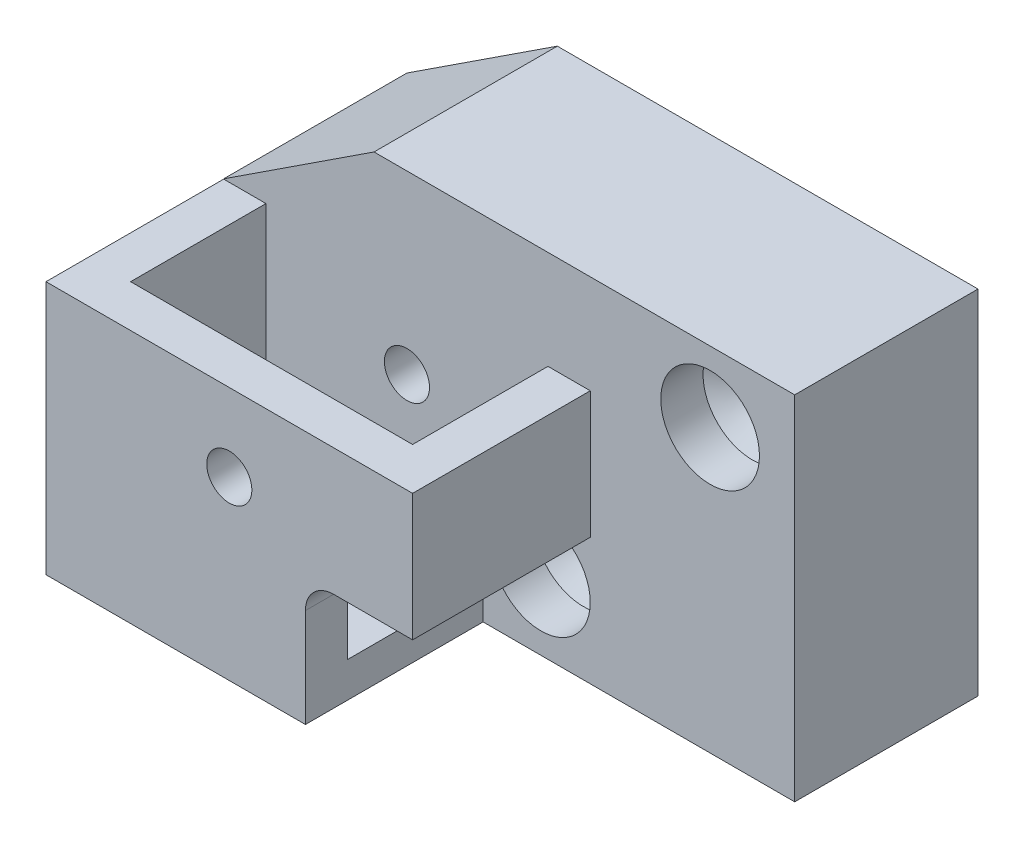
ISO-10303-21;
HEADER;
FILE_DESCRIPTION(('STEP AP214'),'2;1');
FILE_NAME('part.step','',(''),(''),'','','');
FILE_SCHEMA(('AUTOMOTIVE_DESIGN { 1 0 10303 214 1 1 1 1 }'));
ENDSEC;
DATA;
#1=APPLICATION_CONTEXT('core data for automotive mechanical design processes');
#2=APPLICATION_PROTOCOL_DEFINITION('international standard','automotive_design',2000,#1);
#3=PRODUCT_CONTEXT('',#1,'mechanical');
#4=PRODUCT('Part','Part','',(#3));
#5=PRODUCT_RELATED_PRODUCT_CATEGORY('part','',(#4));
#6=PRODUCT_DEFINITION_FORMATION('','',#4);
#7=PRODUCT_DEFINITION_CONTEXT('part definition',#1,'design');
#8=PRODUCT_DEFINITION('design','',#6,#7);
#9=PRODUCT_DEFINITION_SHAPE('','',#8);
#10=(LENGTH_UNIT() NAMED_UNIT(*) SI_UNIT(.MILLI.,.METRE.));
#11=(NAMED_UNIT(*) PLANE_ANGLE_UNIT() SI_UNIT($,.RADIAN.));
#12=(NAMED_UNIT(*) SI_UNIT($,.STERADIAN.) SOLID_ANGLE_UNIT());
#13=UNCERTAINTY_MEASURE_WITH_UNIT(LENGTH_MEASURE(1.E-05),#10,'distance_accuracy_value','');
#14=(GEOMETRIC_REPRESENTATION_CONTEXT(3) GLOBAL_UNCERTAINTY_ASSIGNED_CONTEXT((#13)) GLOBAL_UNIT_ASSIGNED_CONTEXT((#10,
#11,#12)) REPRESENTATION_CONTEXT('',''));
#15=CARTESIAN_POINT('',(0.,0.,0.));
#16=DIRECTION('',(0.,0.,1.));
#17=DIRECTION('',(1.,0.,0.));
#18=AXIS2_PLACEMENT_3D('',#15,#16,#17);
#19=CARTESIAN_POINT('',(269.1,0.,0.));
#20=DIRECTION('',(1.,0.,0.));
#21=DIRECTION('',(0.,0.,-1.));
#22=AXIS2_PLACEMENT_3D('',#19,#20,#21);
#23=PLANE('',#22);
#24=DIRECTION('',(0.,-1.,0.));
#25=VECTOR('',#24,1.);
#26=CARTESIAN_POINT('',(269.1,15.,20.1));
#27=LINE('',#26,#25);
#28=CARTESIAN_POINT('',(269.1,24.,20.1));
#29=VERTEX_POINT('',#28);
#30=CARTESIAN_POINT('',(269.1,15.,20.1));
#31=VERTEX_POINT('',#30);
#32=EDGE_CURVE('E309',#29,#31,#27,.T.);
#33=ORIENTED_EDGE('',*,*,#32,.F.);
#34=DIRECTION('',(0.,0.,1.));
#35=VECTOR('',#34,1.);
#36=CARTESIAN_POINT('',(269.1,24.,10.5));
#37=LINE('',#36,#35);
#38=CARTESIAN_POINT('',(269.1,24.,10.5));
#39=VERTEX_POINT('',#38);
#40=EDGE_CURVE('E321',#39,#29,#37,.T.);
#41=ORIENTED_EDGE('',*,*,#40,.F.);
#42=DIRECTION('',(0.,1.,0.));
#43=VECTOR('',#42,1.);
#44=CARTESIAN_POINT('',(269.1,15.,10.5));
#45=LINE('',#44,#43);
#46=CARTESIAN_POINT('',(269.1,15.,10.5));
#47=VERTEX_POINT('',#46);
#48=EDGE_CURVE('E328',#47,#39,#45,.T.);
#49=ORIENTED_EDGE('',*,*,#48,.F.);
#50=DIRECTION('',(0.,0.,-1.));
#51=VECTOR('',#50,1.);
#52=CARTESIAN_POINT('',(269.1,15.,23.1));
#53=LINE('',#52,#51);
#54=EDGE_CURVE('E324',#31,#47,#53,.T.);
#55=ORIENTED_EDGE('',*,*,#54,.F.);
#56=EDGE_LOOP('',(#33,#41,#49,#55));
#57=FACE_BOUND('',#56,.T.);
#58=ADVANCED_FACE('F33',(#57),#23,.F.);
#59=CARTESIAN_POINT('',(269.1,24.,10.5));
#60=DIRECTION('',(0.,1.,0.));
#61=DIRECTION('',(0.,0.,1.));
#62=AXIS2_PLACEMENT_3D('',#59,#60,#61);
#63=PLANE('',#62);
#64=DIRECTION('',(0.,0.,1.));
#65=VECTOR('',#64,1.);
#66=CARTESIAN_POINT('',(272.1,24.,10.5));
#67=LINE('',#66,#65);
#68=CARTESIAN_POINT('',(272.1,24.,10.5));
#69=VERTEX_POINT('',#68);
#70=CARTESIAN_POINT('',(272.1,24.,23.1));
#71=VERTEX_POINT('',#70);
#72=EDGE_CURVE('E320',#69,#71,#67,.T.);
#73=ORIENTED_EDGE('',*,*,#72,.F.);
#74=DIRECTION('',(1.,0.,0.));
#75=VECTOR('',#74,1.);
#76=CARTESIAN_POINT('',(269.1,24.,10.5));
#77=LINE('',#76,#75);
#78=EDGE_CURVE('E341',#39,#69,#77,.T.);
#79=ORIENTED_EDGE('',*,*,#78,.F.);
#80=ORIENTED_EDGE('',*,*,#40,.T.);
#81=DIRECTION('',(1.,0.,0.));
#82=VECTOR('',#81,1.);
#83=CARTESIAN_POINT('',(249.1,24.,20.1));
#84=LINE('',#83,#82);
#85=CARTESIAN_POINT('',(249.1,24.,20.1));
#86=VERTEX_POINT('',#85);
#87=EDGE_CURVE('E317',#86,#29,#84,.T.);
#88=ORIENTED_EDGE('',*,*,#87,.F.);
#89=DIRECTION('',(0.,0.,-1.));
#90=VECTOR('',#89,1.);
#91=CARTESIAN_POINT('',(249.1,24.,10.5));
#92=LINE('',#91,#90);
#93=CARTESIAN_POINT('',(249.1,24.,10.5));
#94=VERTEX_POINT('',#93);
#95=EDGE_CURVE('E296',#86,#94,#92,.T.);
#96=ORIENTED_EDGE('',*,*,#95,.T.);
#97=DIRECTION('',(1.,0.,0.));
#98=VECTOR('',#97,1.);
#99=CARTESIAN_POINT('',(246.1,24.,10.5));
#100=LINE('',#99,#98);
#101=CARTESIAN_POINT('',(246.1,24.,10.5));
#102=VERTEX_POINT('',#101);
#103=EDGE_CURVE('E303',#102,#94,#100,.T.);
#104=ORIENTED_EDGE('',*,*,#103,.F.);
#105=DIRECTION('',(0.,0.,-1.));
#106=VECTOR('',#105,1.);
#107=CARTESIAN_POINT('',(246.1,24.,10.5));
#108=LINE('',#107,#106);
#109=CARTESIAN_POINT('',(246.1,24.,23.1));
#110=VERTEX_POINT('',#109);
#111=EDGE_CURVE('E300',#110,#102,#108,.T.);
#112=ORIENTED_EDGE('',*,*,#111,.F.);
#113=DIRECTION('',(1.,0.,0.));
#114=VECTOR('',#113,1.);
#115=CARTESIAN_POINT('',(269.1,24.,23.1));
#116=LINE('',#115,#114);
#117=EDGE_CURVE('E330',#110,#71,#116,.T.);
#118=ORIENTED_EDGE('',*,*,#117,.T.);
#119=EDGE_LOOP('',(#73,#79,#80,#88,#96,#104,#112,#118));
#120=FACE_BOUND('',#119,.T.);
#121=ADVANCED_FACE('F431',(#120),#63,.T.);
#122=CARTESIAN_POINT('',(269.1,15.,23.1));
#123=DIRECTION('',(0.,-1.,0.));
#124=DIRECTION('',(0.,0.,-1.));
#125=AXIS2_PLACEMENT_3D('',#122,#123,#124);
#126=PLANE('',#125);
#127=DIRECTION('',(1.,0.,0.));
#128=VECTOR('',#127,1.);
#129=CARTESIAN_POINT('',(269.1,15.,23.1));
#130=LINE('',#129,#128);
#131=CARTESIAN_POINT('',(266.5,15.,23.1));
#132=VERTEX_POINT('',#131);
#133=CARTESIAN_POINT('',(272.1,15.,23.1));
#134=VERTEX_POINT('',#133);
#135=EDGE_CURVE('E347',#132,#134,#130,.T.);
#136=ORIENTED_EDGE('',*,*,#135,.F.);
#137=DIRECTION('',(0.,0.,1.));
#138=VECTOR('',#137,1.);
#139=CARTESIAN_POINT('',(266.5,15.,23.1));
#140=LINE('',#139,#138);
#141=CARTESIAN_POINT('',(266.5,15.,20.1));
#142=VERTEX_POINT('',#141);
#143=EDGE_CURVE('E374',#132,#142,#140,.F.);
#144=ORIENTED_EDGE('',*,*,#143,.T.);
#145=DIRECTION('',(1.,0.,0.));
#146=VECTOR('',#145,1.);
#147=CARTESIAN_POINT('',(249.1,15.,20.1));
#148=LINE('',#147,#146);
#149=EDGE_CURVE('E313',#142,#31,#148,.T.);
#150=ORIENTED_EDGE('',*,*,#149,.T.);
#151=ORIENTED_EDGE('',*,*,#54,.T.);
#152=DIRECTION('',(1.,0.,0.));
#153=VECTOR('',#152,1.);
#154=CARTESIAN_POINT('',(269.1,15.,10.5));
#155=LINE('',#154,#153);
#156=CARTESIAN_POINT('',(272.1,15.,10.5));
#157=VERTEX_POINT('',#156);
#158=EDGE_CURVE('E344',#47,#157,#155,.T.);
#159=ORIENTED_EDGE('',*,*,#158,.T.);
#160=DIRECTION('',(0.,0.,-1.));
#161=VECTOR('',#160,1.);
#162=CARTESIAN_POINT('',(272.1,15.,23.1));
#163=LINE('',#162,#161);
#164=EDGE_CURVE('E336',#134,#157,#163,.T.);
#165=ORIENTED_EDGE('',*,*,#164,.F.);
#166=EDGE_LOOP('',(#136,#144,#150,#151,#159,#165));
#167=FACE_BOUND('',#166,.T.);
#168=ADVANCED_FACE('F377',(#167),#126,.T.);
#169=CARTESIAN_POINT('',(269.1,24.,23.1));
#170=DIRECTION('',(0.,0.,1.));
#171=DIRECTION('',(1.,0.,0.));
#172=AXIS2_PLACEMENT_3D('',#169,#170,#171);
#173=PLANE('',#172);
#174=CARTESIAN_POINT('',(259.1,18.5,23.1));
#175=DIRECTION('',(0.,0.,1.));
#176=DIRECTION('',(1.,0.,0.));
#177=AXIS2_PLACEMENT_3D('',#174,#175,#176);
#178=CIRCLE('',#177,1.59999999999999);
#179=CARTESIAN_POINT('',(260.7,18.5,23.1));
#180=VERTEX_POINT('',#179);
#181=EDGE_CURVE('E544',#180,#180,#178,.T.);
#182=ORIENTED_EDGE('',*,*,#181,.F.);
#183=EDGE_LOOP('',(#182));
#184=FACE_BOUND('',#183,.T.);
#185=DIRECTION('',(0.,-1.,0.));
#186=VECTOR('',#185,1.);
#187=CARTESIAN_POINT('',(272.1,24.,23.1));
#188=LINE('',#187,#186);
#189=EDGE_CURVE('E333',#71,#134,#188,.T.);
#190=ORIENTED_EDGE('',*,*,#189,.F.);
#191=ORIENTED_EDGE('',*,*,#117,.F.);
#192=DIRECTION('',(0.,1.,0.));
#193=VECTOR('',#192,1.);
#194=CARTESIAN_POINT('',(246.1,24.,23.1));
#195=LINE('',#194,#193);
#196=CARTESIAN_POINT('',(246.1,5.99999999999983,23.1));
#197=VERTEX_POINT('',#196);
#198=EDGE_CURVE('E297',#197,#110,#195,.T.);
#199=ORIENTED_EDGE('',*,*,#198,.F.);
#200=DIRECTION('',(-1.,0.,0.));
#201=VECTOR('',#200,1.);
#202=CARTESIAN_POINT('',(246.1,5.99999999999983,23.1));
#203=LINE('',#202,#201);
#204=CARTESIAN_POINT('',(264.5,5.9999999999998,23.1));
#205=VERTEX_POINT('',#204);
#206=EDGE_CURVE('E277',#205,#197,#203,.T.);
#207=ORIENTED_EDGE('',*,*,#206,.F.);
#208=DIRECTION('',(0.,1.,0.));
#209=VECTOR('',#208,1.);
#210=CARTESIAN_POINT('',(264.5,8.49999999999996,23.1));
#211=LINE('',#210,#209);
#212=CARTESIAN_POINT('',(264.5,13.,23.1));
#213=VERTEX_POINT('',#212);
#214=EDGE_CURVE('E291',#205,#213,#211,.T.);
#215=ORIENTED_EDGE('',*,*,#214,.T.);
#216=CARTESIAN_POINT('',(266.5,13.,23.1));
#217=DIRECTION('',(0.,0.,1.));
#218=DIRECTION('',(1.,0.,0.));
#219=AXIS2_PLACEMENT_3D('',#216,#217,#218);
#220=CIRCLE('',#219,2.);
#221=EDGE_CURVE('E41',#213,#132,#220,.F.);
#222=ORIENTED_EDGE('',*,*,#221,.T.);
#223=ORIENTED_EDGE('',*,*,#135,.T.);
#224=EDGE_LOOP('',(#190,#191,#199,#207,#215,#222,#223));
#225=FACE_BOUND('',#224,.T.);
#226=ADVANCED_FACE('F389',(#184,#225),#173,.T.);
#227=CARTESIAN_POINT('',(272.1,0.,0.));
#228=DIRECTION('',(1.,0.,0.));
#229=DIRECTION('',(0.,0.,-1.));
#230=AXIS2_PLACEMENT_3D('',#227,#228,#229);
#231=PLANE('',#230);
#232=ORIENTED_EDGE('',*,*,#72,.T.);
#233=ORIENTED_EDGE('',*,*,#189,.T.);
#234=ORIENTED_EDGE('',*,*,#164,.T.);
#235=DIRECTION('',(0.,1.,0.));
#236=VECTOR('',#235,1.);
#237=CARTESIAN_POINT('',(272.1,15.,10.5));
#238=LINE('',#237,#236);
#239=EDGE_CURVE('E325',#157,#69,#238,.T.);
#240=ORIENTED_EDGE('',*,*,#239,.T.);
#241=EDGE_LOOP('',(#232,#233,#234,#240));
#242=FACE_BOUND('',#241,.T.);
#243=ADVANCED_FACE('F442',(#242),#231,.T.);
#244=CARTESIAN_POINT('',(249.1,15.,20.1));
#245=DIRECTION('',(0.,0.,1.));
#246=DIRECTION('',(1.,0.,0.));
#247=AXIS2_PLACEMENT_3D('',#244,#245,#246);
#248=PLANE('',#247);
#249=CARTESIAN_POINT('',(259.1,18.5,20.1));
#250=DIRECTION('',(0.,0.,1.));
#251=DIRECTION('',(1.,0.,0.));
#252=AXIS2_PLACEMENT_3D('',#249,#250,#251);
#253=CIRCLE('',#252,1.59999999999999);
#254=CARTESIAN_POINT('',(260.7,18.5,20.1));
#255=VERTEX_POINT('',#254);
#256=EDGE_CURVE('E547',#255,#255,#253,.T.);
#257=ORIENTED_EDGE('',*,*,#256,.T.);
#258=EDGE_LOOP('',(#257));
#259=FACE_BOUND('',#258,.T.);
#260=DIRECTION('',(1.,0.,0.));
#261=VECTOR('',#260,1.);
#262=CARTESIAN_POINT('',(264.5,8.49999999999996,20.1));
#263=LINE('',#262,#261);
#264=CARTESIAN_POINT('',(251.1,8.49999999999996,20.1));
#265=VERTEX_POINT('',#264);
#266=CARTESIAN_POINT('',(264.5,8.49999999999959,20.1));
#267=VERTEX_POINT('',#266);
#268=EDGE_CURVE('E289',#265,#267,#263,.T.);
#269=ORIENTED_EDGE('',*,*,#268,.F.);
#270=CARTESIAN_POINT('',(251.1,10.4999999999996,20.1));
#271=DIRECTION('',(0.,0.,1.));
#272=DIRECTION('',(1.,0.,0.));
#273=AXIS2_PLACEMENT_3D('',#270,#271,#272);
#274=CIRCLE('',#273,2.);
#275=CARTESIAN_POINT('',(249.1,10.4999999999996,20.1));
#276=VERTEX_POINT('',#275);
#277=EDGE_CURVE('E366',#265,#276,#274,.F.);
#278=ORIENTED_EDGE('',*,*,#277,.T.);
#279=DIRECTION('',(0.,-1.,0.));
#280=VECTOR('',#279,1.);
#281=CARTESIAN_POINT('',(249.1,15.,20.1));
#282=LINE('',#281,#280);
#283=EDGE_CURVE('E310',#86,#276,#282,.T.);
#284=ORIENTED_EDGE('',*,*,#283,.F.);
#285=ORIENTED_EDGE('',*,*,#87,.T.);
#286=ORIENTED_EDGE('',*,*,#32,.T.);
#287=ORIENTED_EDGE('',*,*,#149,.F.);
#288=CARTESIAN_POINT('',(266.5,13.,20.1));
#289=DIRECTION('',(0.,0.,1.));
#290=DIRECTION('',(1.,0.,0.));
#291=AXIS2_PLACEMENT_3D('',#288,#289,#290);
#292=CIRCLE('',#291,2.);
#293=CARTESIAN_POINT('',(264.5,13.,20.1));
#294=VERTEX_POINT('',#293);
#295=EDGE_CURVE('E11',#142,#294,#292,.T.);
#296=ORIENTED_EDGE('',*,*,#295,.T.);
#297=DIRECTION('',(0.,1.,0.));
#298=VECTOR('',#297,1.);
#299=CARTESIAN_POINT('',(264.5,8.49999999999996,20.1));
#300=LINE('',#299,#298);
#301=EDGE_CURVE('E293',#267,#294,#300,.T.);
#302=ORIENTED_EDGE('',*,*,#301,.F.);
#303=EDGE_LOOP('',(#269,#278,#284,#285,#286,#287,#296,#302));
#304=FACE_BOUND('',#303,.T.);
#305=ADVANCED_FACE('F383',(#259,#304),#248,.F.);
#306=CARTESIAN_POINT('',(246.1,0.,0.));
#307=DIRECTION('',(1.,0.,0.));
#308=DIRECTION('',(0.,0.,-1.));
#309=AXIS2_PLACEMENT_3D('',#306,#307,#308);
#310=PLANE('',#309);
#311=DIRECTION('',(0.,1.,0.));
#312=VECTOR('',#311,1.);
#313=CARTESIAN_POINT('',(246.1,31.0000000000001,10.5));
#314=LINE('',#313,#312);
#315=CARTESIAN_POINT('',(246.1,24.018019493939,10.5));
#316=VERTEX_POINT('',#315);
#317=EDGE_CURVE('E251',#102,#316,#314,.T.);
#318=ORIENTED_EDGE('',*,*,#317,.T.);
#319=DIRECTION('',(0.,0.,-1.));
#320=VECTOR('',#319,1.);
#321=CARTESIAN_POINT('',(246.1,24.018019493939,0.));
#322=LINE('',#321,#320);
#323=CARTESIAN_POINT('',(246.1,24.018019493939,-2.5));
#324=VERTEX_POINT('',#323);
#325=EDGE_CURVE('E359',#316,#324,#322,.T.);
#326=ORIENTED_EDGE('',*,*,#325,.T.);
#327=DIRECTION('',(0.,1.,0.));
#328=VECTOR('',#327,1.);
#329=CARTESIAN_POINT('',(246.1,31.0000000000001,-2.5));
#330=LINE('',#329,#328);
#331=CARTESIAN_POINT('',(246.1,6.00000000000023,-2.5));
#332=VERTEX_POINT('',#331);
#333=EDGE_CURVE('E256',#332,#324,#330,.T.);
#334=ORIENTED_EDGE('',*,*,#333,.F.);
#335=DIRECTION('',(0.,0.,-1.));
#336=VECTOR('',#335,1.);
#337=CARTESIAN_POINT('',(246.1,5.99999999999983,10.5));
#338=LINE('',#337,#336);
#339=EDGE_CURVE('E281',#197,#332,#338,.T.);
#340=ORIENTED_EDGE('',*,*,#339,.F.);
#341=ORIENTED_EDGE('',*,*,#198,.T.);
#342=ORIENTED_EDGE('',*,*,#111,.T.);
#343=EDGE_LOOP('',(#318,#326,#334,#340,#341,#342));
#344=FACE_BOUND('',#343,.T.);
#345=ADVANCED_FACE('F396',(#344),#310,.F.);
#346=CARTESIAN_POINT('',(249.1,0.,0.));
#347=DIRECTION('',(1.,0.,0.));
#348=DIRECTION('',(0.,0.,-1.));
#349=AXIS2_PLACEMENT_3D('',#346,#347,#348);
#350=PLANE('',#349);
#351=ORIENTED_EDGE('',*,*,#283,.T.);
#352=DIRECTION('',(0.,0.,1.));
#353=VECTOR('',#352,1.);
#354=CARTESIAN_POINT('',(249.1,10.4999999999996,10.5));
#355=LINE('',#354,#353);
#356=CARTESIAN_POINT('',(249.1,10.4999999999996,10.5));
#357=VERTEX_POINT('',#356);
#358=EDGE_CURVE('E368',#276,#357,#355,.F.);
#359=ORIENTED_EDGE('',*,*,#358,.T.);
#360=DIRECTION('',(0.,-1.,0.));
#361=VECTOR('',#360,1.);
#362=CARTESIAN_POINT('',(249.1,15.,10.5));
#363=LINE('',#362,#361);
#364=EDGE_CURVE('E301',#94,#357,#363,.T.);
#365=ORIENTED_EDGE('',*,*,#364,.F.);
#366=ORIENTED_EDGE('',*,*,#95,.F.);
#367=EDGE_LOOP('',(#351,#359,#365,#366));
#368=FACE_BOUND('',#367,.T.);
#369=ADVANCED_FACE('F470',(#368),#350,.T.);
#370=CARTESIAN_POINT('',(264.5,8.49999999999996,23.1));
#371=DIRECTION('',(-1.,0.,0.));
#372=DIRECTION('',(0.,0.,1.));
#373=AXIS2_PLACEMENT_3D('',#370,#371,#372);
#374=PLANE('',#373);
#375=ORIENTED_EDGE('',*,*,#301,.T.);
#376=DIRECTION('',(0.,0.,1.));
#377=VECTOR('',#376,1.);
#378=CARTESIAN_POINT('',(264.5,13.,23.1));
#379=LINE('',#378,#377);
#380=EDGE_CURVE('E372',#294,#213,#379,.T.);
#381=ORIENTED_EDGE('',*,*,#380,.T.);
#382=ORIENTED_EDGE('',*,*,#214,.F.);
#383=DIRECTION('',(0.,0.,1.));
#384=VECTOR('',#383,1.);
#385=CARTESIAN_POINT('',(264.5,5.9999999999998,23.1));
#386=LINE('',#385,#384);
#387=CARTESIAN_POINT('',(264.5,5.9999999999998,10.5));
#388=VERTEX_POINT('',#387);
#389=EDGE_CURVE('E274',#388,#205,#386,.T.);
#390=ORIENTED_EDGE('',*,*,#389,.F.);
#391=DIRECTION('',(0.,1.,0.));
#392=VECTOR('',#391,1.);
#393=CARTESIAN_POINT('',(264.5,5.9999999999998,10.5));
#394=LINE('',#393,#392);
#395=CARTESIAN_POINT('',(264.5,8.49999999999959,10.5));
#396=VERTEX_POINT('',#395);
#397=EDGE_CURVE('E283',#388,#396,#394,.T.);
#398=ORIENTED_EDGE('',*,*,#397,.T.);
#399=DIRECTION('',(0.,0.,1.));
#400=VECTOR('',#399,1.);
#401=CARTESIAN_POINT('',(264.5,8.49999999999959,23.1));
#402=LINE('',#401,#400);
#403=EDGE_CURVE('E278',#396,#267,#402,.T.);
#404=ORIENTED_EDGE('',*,*,#403,.T.);
#405=EDGE_LOOP('',(#375,#381,#382,#390,#398,#404));
#406=FACE_BOUND('',#405,.T.);
#407=ADVANCED_FACE('F386',(#406),#374,.F.);
#408=CARTESIAN_POINT('',(0.,6.00000000000017,0.));
#409=DIRECTION('',(0.,1.,0.));
#410=DIRECTION('',(-1.,0.,0.));
#411=AXIS2_PLACEMENT_3D('',#408,#409,#410);
#412=PLANE('',#411);
#413=ORIENTED_EDGE('',*,*,#339,.T.);
#414=DIRECTION('',(-1.,0.,0.));
#415=VECTOR('',#414,1.);
#416=CARTESIAN_POINT('',(246.1,6.00000000000023,-2.5));
#417=LINE('',#416,#415);
#418=CARTESIAN_POINT('',(286.599999999998,6.00000000000016,-2.5));
#419=VERTEX_POINT('',#418);
#420=EDGE_CURVE('E253',#419,#332,#417,.T.);
#421=ORIENTED_EDGE('',*,*,#420,.F.);
#422=DIRECTION('',(0.,0.,1.));
#423=VECTOR('',#422,1.);
#424=CARTESIAN_POINT('',(286.599999999998,6.00000000000016,-2.5));
#425=LINE('',#424,#423);
#426=CARTESIAN_POINT('',(286.599999999998,6.00000000000016,10.5));
#427=VERTEX_POINT('',#426);
#428=EDGE_CURVE('E259',#419,#427,#425,.T.);
#429=ORIENTED_EDGE('',*,*,#428,.T.);
#430=DIRECTION('',(-1.,0.,0.));
#431=VECTOR('',#430,1.);
#432=CARTESIAN_POINT('',(246.1,6.00000000000023,10.5));
#433=LINE('',#432,#431);
#434=EDGE_CURVE('E263',#427,#388,#433,.T.);
#435=ORIENTED_EDGE('',*,*,#434,.T.);
#436=ORIENTED_EDGE('',*,*,#389,.T.);
#437=ORIENTED_EDGE('',*,*,#206,.T.);
#438=EDGE_LOOP('',(#413,#421,#429,#435,#436,#437));
#439=FACE_BOUND('',#438,.T.);
#440=ADVANCED_FACE('F392',(#439),#412,.F.);
#441=CARTESIAN_POINT('',(0.,8.49999999999996,0.));
#442=DIRECTION('',(0.,1.,0.));
#443=DIRECTION('',(-1.,0.,0.));
#444=AXIS2_PLACEMENT_3D('',#441,#442,#443);
#445=PLANE('',#444);
#446=DIRECTION('',(1.,0.,0.));
#447=VECTOR('',#446,1.);
#448=CARTESIAN_POINT('',(264.5,8.49999999999959,10.5));
#449=LINE('',#448,#447);
#450=CARTESIAN_POINT('',(251.1,8.49999999999961,10.5));
#451=VERTEX_POINT('',#450);
#452=EDGE_CURVE('E273',#451,#396,#449,.T.);
#453=ORIENTED_EDGE('',*,*,#452,.F.);
#454=DIRECTION('',(0.,0.,1.));
#455=VECTOR('',#454,1.);
#456=CARTESIAN_POINT('',(251.1,8.49999999999961,20.1));
#457=LINE('',#456,#455);
#458=EDGE_CURVE('E363',#451,#265,#457,.T.);
#459=ORIENTED_EDGE('',*,*,#458,.T.);
#460=ORIENTED_EDGE('',*,*,#268,.T.);
#461=ORIENTED_EDGE('',*,*,#403,.F.);
#462=EDGE_LOOP('',(#453,#459,#460,#461));
#463=FACE_BOUND('',#462,.T.);
#464=ADVANCED_FACE('F466',(#463),#445,.T.);
#465=CARTESIAN_POINT('',(0.,0.,10.5));
#466=DIRECTION('',(0.,0.,1.));
#467=DIRECTION('',(1.,0.,0.));
#468=AXIS2_PLACEMENT_3D('',#465,#466,#467);
#469=PLANE('',#468);
#470=CARTESIAN_POINT('',(259.1,18.5000000000002,10.5));
#471=DIRECTION('',(0.,0.,1.));
#472=DIRECTION('',(1.,0.,0.));
#473=AXIS2_PLACEMENT_3D('',#470,#471,#472);
#474=CIRCLE('',#473,1.59999999999999);
#475=CARTESIAN_POINT('',(260.7,18.5000000000002,10.5));
#476=VERTEX_POINT('',#475);
#477=EDGE_CURVE('E354',#476,#476,#474,.T.);
#478=ORIENTED_EDGE('',*,*,#477,.F.);
#479=EDGE_LOOP('',(#478));
#480=FACE_BOUND('',#479,.T.);
#481=CARTESIAN_POINT('',(280.599999999998,26.0000000000001,10.5));
#482=DIRECTION('',(0.,0.,1.));
#483=DIRECTION('',(1.,0.,0.));
#484=AXIS2_PLACEMENT_3D('',#481,#482,#483);
#485=CIRCLE('',#484,3.49999999996875);
#486=CARTESIAN_POINT('',(284.099999999967,26.0000000000001,10.5));
#487=VERTEX_POINT('',#486);
#488=EDGE_CURVE('E353',#487,#487,#485,.T.);
#489=ORIENTED_EDGE('',*,*,#488,.F.);
#490=EDGE_LOOP('',(#489));
#491=FACE_BOUND('',#490,.T.);
#492=CARTESIAN_POINT('',(268.599999999998,11.0000000000002,10.5));
#493=DIRECTION('',(0.,0.,1.));
#494=DIRECTION('',(1.,0.,0.));
#495=AXIS2_PLACEMENT_3D('',#492,#493,#494);
#496=CIRCLE('',#495,3.49999999996875);
#497=CARTESIAN_POINT('',(272.099999999967,11.0000000000002,10.5));
#498=VERTEX_POINT('',#497);
#499=EDGE_CURVE('E565',#498,#498,#496,.T.);
#500=ORIENTED_EDGE('',*,*,#499,.F.);
#501=EDGE_LOOP('',(#500));
#502=FACE_BOUND('',#501,.T.);
#503=ORIENTED_EDGE('',*,*,#364,.T.);
#504=CARTESIAN_POINT('',(251.1,10.4999999999996,10.5));
#505=DIRECTION('',(0.,0.,1.));
#506=DIRECTION('',(1.,0.,0.));
#507=AXIS2_PLACEMENT_3D('',#504,#505,#506);
#508=CIRCLE('',#507,2.);
#509=EDGE_CURVE('E370',#357,#451,#508,.T.);
#510=ORIENTED_EDGE('',*,*,#509,.T.);
#511=ORIENTED_EDGE('',*,*,#452,.T.);
#512=ORIENTED_EDGE('',*,*,#397,.F.);
#513=ORIENTED_EDGE('',*,*,#434,.F.);
#514=DIRECTION('',(0.,-1.,0.));
#515=VECTOR('',#514,1.);
#516=CARTESIAN_POINT('',(286.599999999998,6.00000000000016,10.5));
#517=LINE('',#516,#515);
#518=CARTESIAN_POINT('',(286.599999999998,31.0000000000001,10.5));
#519=VERTEX_POINT('',#518);
#520=EDGE_CURVE('E261',#519,#427,#517,.T.);
#521=ORIENTED_EDGE('',*,*,#520,.F.);
#522=DIRECTION('',(1.,0.,0.));
#523=VECTOR('',#522,1.);
#524=CARTESIAN_POINT('',(286.599999999998,31.0000000000001,10.5));
#525=LINE('',#524,#523);
#526=CARTESIAN_POINT('',(256.76515138991,31.0000000000001,10.5));
#527=VERTEX_POINT('',#526);
#528=EDGE_CURVE('E240',#527,#519,#525,.T.);
#529=ORIENTED_EDGE('',*,*,#528,.F.);
#530=DIRECTION('',(0.836660026534065,0.547722557505183,0.));
#531=VECTOR('',#530,1.);
#532=CARTESIAN_POINT('',(62.8235607626143,-95.9645742071083,10.5));
#533=LINE('',#532,#531);
#534=EDGE_CURVE('E357',#527,#316,#533,.F.);
#535=ORIENTED_EDGE('',*,*,#534,.T.);
#536=ORIENTED_EDGE('',*,*,#317,.F.);
#537=ORIENTED_EDGE('',*,*,#103,.T.);
#538=EDGE_LOOP('',(#503,#510,#511,#512,#513,#521,#529,#535,#536,#537));
#539=FACE_BOUND('',#538,.T.);
#540=ORIENTED_EDGE('',*,*,#48,.T.);
#541=ORIENTED_EDGE('',*,*,#78,.T.);
#542=ORIENTED_EDGE('',*,*,#239,.F.);
#543=ORIENTED_EDGE('',*,*,#158,.F.);
#544=EDGE_LOOP('',(#540,#541,#542,#543));
#545=FACE_BOUND('',#544,.T.);
#546=ADVANCED_FACE('F411',(#480,#491,#502,#539,#545),#469,.T.);
#547=CARTESIAN_POINT('',(286.599999999998,31.0000000000001,-2.5));
#548=DIRECTION('',(0.,-1.,0.));
#549=DIRECTION('',(0.,0.,-1.));
#550=AXIS2_PLACEMENT_3D('',#547,#548,#549);
#551=PLANE('',#550);
#552=DIRECTION('',(1.,0.,0.));
#553=VECTOR('',#552,1.);
#554=CARTESIAN_POINT('',(286.599999999998,31.0000000000001,-2.5));
#555=LINE('',#554,#553);
#556=CARTESIAN_POINT('',(256.76515138991,31.0000000000001,-2.5));
#557=VERTEX_POINT('',#556);
#558=CARTESIAN_POINT('',(286.599999999998,31.0000000000001,-2.5));
#559=VERTEX_POINT('',#558);
#560=EDGE_CURVE('E248',#557,#559,#555,.T.);
#561=ORIENTED_EDGE('',*,*,#560,.F.);
#562=DIRECTION('',(0.,0.,1.));
#563=VECTOR('',#562,1.);
#564=CARTESIAN_POINT('',(256.76515138991,31.0000000000001,-2.5));
#565=LINE('',#564,#563);
#566=EDGE_CURVE('E343',#557,#527,#565,.T.);
#567=ORIENTED_EDGE('',*,*,#566,.T.);
#568=ORIENTED_EDGE('',*,*,#528,.T.);
#569=DIRECTION('',(0.,0.,1.));
#570=VECTOR('',#569,1.);
#571=CARTESIAN_POINT('',(286.599999999998,31.0000000000001,-2.5));
#572=LINE('',#571,#570);
#573=EDGE_CURVE('E270',#559,#519,#572,.T.);
#574=ORIENTED_EDGE('',*,*,#573,.F.);
#575=EDGE_LOOP('',(#561,#567,#568,#574));
#576=FACE_BOUND('',#575,.T.);
#577=ADVANCED_FACE('F407',(#576),#551,.F.);
#578=CARTESIAN_POINT('',(286.599999999998,6.00000000000016,-2.5));
#579=DIRECTION('',(-1.,0.,0.));
#580=DIRECTION('',(0.,0.,1.));
#581=AXIS2_PLACEMENT_3D('',#578,#579,#580);
#582=PLANE('',#581);
#583=ORIENTED_EDGE('',*,*,#520,.T.);
#584=ORIENTED_EDGE('',*,*,#428,.F.);
#585=DIRECTION('',(0.,-1.,0.));
#586=VECTOR('',#585,1.);
#587=CARTESIAN_POINT('',(286.599999999998,6.00000000000016,-2.5));
#588=LINE('',#587,#586);
#589=EDGE_CURVE('E250',#559,#419,#588,.T.);
#590=ORIENTED_EDGE('',*,*,#589,.F.);
#591=ORIENTED_EDGE('',*,*,#573,.T.);
#592=EDGE_LOOP('',(#583,#584,#590,#591));
#593=FACE_BOUND('',#592,.T.);
#594=ADVANCED_FACE('F419',(#593),#582,.F.);
#595=CARTESIAN_POINT('',(0.,0.,-2.5));
#596=DIRECTION('',(0.,0.,1.));
#597=DIRECTION('',(1.,0.,0.));
#598=AXIS2_PLACEMENT_3D('',#595,#596,#597);
#599=PLANE('',#598);
#600=CARTESIAN_POINT('',(280.599999999998,26.0000000000001,-2.5));
#601=DIRECTION('',(0.,0.,1.));
#602=DIRECTION('',(1.,0.,0.));
#603=AXIS2_PLACEMENT_3D('',#600,#601,#602);
#604=CIRCLE('',#603,1.59999999999999);
#605=CARTESIAN_POINT('',(282.199999999998,26.0000000000001,-2.5));
#606=VERTEX_POINT('',#605);
#607=EDGE_CURVE('E562',#606,#606,#604,.T.);
#608=ORIENTED_EDGE('',*,*,#607,.T.);
#609=EDGE_LOOP('',(#608));
#610=FACE_BOUND('',#609,.T.);
#611=CARTESIAN_POINT('',(268.599999999998,11.0000000000002,-2.5));
#612=DIRECTION('',(0.,0.,1.));
#613=DIRECTION('',(1.,0.,0.));
#614=AXIS2_PLACEMENT_3D('',#611,#612,#613);
#615=CIRCLE('',#614,1.59999999999999);
#616=CARTESIAN_POINT('',(270.199999999998,11.0000000000002,-2.5));
#617=VERTEX_POINT('',#616);
#618=EDGE_CURVE('E217',#617,#617,#615,.T.);
#619=ORIENTED_EDGE('',*,*,#618,.T.);
#620=EDGE_LOOP('',(#619));
#621=FACE_BOUND('',#620,.T.);
#622=DIRECTION('',(-0.499999999999972,0.866025403784454,0.));
#623=VECTOR('',#622,1.);
#624=CARTESIAN_POINT('',(257.454551732809,15.6500000000002,-2.5));
#625=LINE('',#624,#623);
#626=CARTESIAN_POINT('',(257.454551732809,15.6500000000002,-2.5));
#627=VERTEX_POINT('',#626);
#628=CARTESIAN_POINT('',(255.809103465619,18.5000000000001,-2.5));
#629=VERTEX_POINT('',#628);
#630=EDGE_CURVE('E228',#627,#629,#625,.T.);
#631=ORIENTED_EDGE('',*,*,#630,.F.);
#632=DIRECTION('',(-1.,0.,0.));
#633=VECTOR('',#632,1.);
#634=CARTESIAN_POINT('',(260.74544826719,15.6500000000001,-2.5));
#635=LINE('',#634,#633);
#636=CARTESIAN_POINT('',(260.74544826719,15.6500000000001,-2.5));
#637=VERTEX_POINT('',#636);
#638=EDGE_CURVE('E193',#637,#627,#635,.T.);
#639=ORIENTED_EDGE('',*,*,#638,.F.);
#640=DIRECTION('',(-0.500000000000084,-0.86602540378439,0.));
#641=VECTOR('',#640,1.);
#642=CARTESIAN_POINT('',(262.390896534381,18.5000000000001,-2.5));
#643=LINE('',#642,#641);
#644=CARTESIAN_POINT('',(262.390896534381,18.5000000000001,-2.5));
#645=VERTEX_POINT('',#644);
#646=EDGE_CURVE('E211',#645,#637,#643,.T.);
#647=ORIENTED_EDGE('',*,*,#646,.F.);
#648=DIRECTION('',(0.500000000000081,-0.866025403784392,0.));
#649=VECTOR('',#648,1.);
#650=CARTESIAN_POINT('',(260.74544826719,21.3500000000002,-2.5));
#651=LINE('',#650,#649);
#652=CARTESIAN_POINT('',(260.74544826719,21.3500000000002,-2.5));
#653=VERTEX_POINT('',#652);
#654=EDGE_CURVE('E214',#653,#645,#651,.T.);
#655=ORIENTED_EDGE('',*,*,#654,.F.);
#656=DIRECTION('',(1.,0.,0.));
#657=VECTOR('',#656,1.);
#658=CARTESIAN_POINT('',(257.454551732809,21.3500000000001,-2.5));
#659=LINE('',#658,#657);
#660=CARTESIAN_POINT('',(257.454551732809,21.3500000000001,-2.5));
#661=VERTEX_POINT('',#660);
#662=EDGE_CURVE('E233',#661,#653,#659,.T.);
#663=ORIENTED_EDGE('',*,*,#662,.F.);
#664=DIRECTION('',(0.499999999999987,0.866025403784446,0.));
#665=VECTOR('',#664,1.);
#666=CARTESIAN_POINT('',(255.809103465619,18.5000000000001,-2.5));
#667=LINE('',#666,#665);
#668=EDGE_CURVE('E230',#629,#661,#667,.T.);
#669=ORIENTED_EDGE('',*,*,#668,.F.);
#670=EDGE_LOOP('',(#631,#639,#647,#655,#663,#669));
#671=FACE_BOUND('',#670,.T.);
#672=ORIENTED_EDGE('',*,*,#333,.T.);
#673=DIRECTION('',(-0.836660026534065,-0.547722557505183,0.));
#674=VECTOR('',#673,1.);
#675=CARTESIAN_POINT('',(256.76515138991,31.0000000000001,-2.5));
#676=LINE('',#675,#674);
#677=EDGE_CURVE('E361',#324,#557,#676,.F.);
#678=ORIENTED_EDGE('',*,*,#677,.T.);
#679=ORIENTED_EDGE('',*,*,#560,.T.);
#680=ORIENTED_EDGE('',*,*,#589,.T.);
#681=ORIENTED_EDGE('',*,*,#420,.T.);
#682=EDGE_LOOP('',(#672,#678,#679,#680,#681));
#683=FACE_BOUND('',#682,.T.);
#684=ADVANCED_FACE('F400',(#610,#621,#671,#683),#599,.F.);
#685=CARTESIAN_POINT('',(260.74544826719,15.6500000000001,0.500000000000001));
#686=DIRECTION('',(0.,-1.,0.));
#687=DIRECTION('',(1.,0.,0.));
#688=AXIS2_PLACEMENT_3D('',#685,#686,#687);
#689=PLANE('',#688);
#690=ORIENTED_EDGE('',*,*,#638,.T.);
#691=DIRECTION('',(0.,0.,-1.));
#692=VECTOR('',#691,1.);
#693=CARTESIAN_POINT('',(257.454551732809,15.6500000000002,0.500000000000001));
#694=LINE('',#693,#692);
#695=CARTESIAN_POINT('',(257.454551732809,15.6500000000002,0.500000000000001));
#696=VERTEX_POINT('',#695);
#697=EDGE_CURVE('E186',#696,#627,#694,.T.);
#698=ORIENTED_EDGE('',*,*,#697,.F.);
#699=DIRECTION('',(-1.,0.,0.));
#700=VECTOR('',#699,1.);
#701=CARTESIAN_POINT('',(260.74544826719,15.6500000000001,0.500000000000001));
#702=LINE('',#701,#700);
#703=CARTESIAN_POINT('',(260.74544826719,15.6500000000001,0.500000000000001));
#704=VERTEX_POINT('',#703);
#705=EDGE_CURVE('E190',#704,#696,#702,.T.);
#706=ORIENTED_EDGE('',*,*,#705,.F.);
#707=DIRECTION('',(0.,0.,-1.));
#708=VECTOR('',#707,1.);
#709=CARTESIAN_POINT('',(260.74544826719,15.6500000000001,0.500000000000001));
#710=LINE('',#709,#708);
#711=EDGE_CURVE('E238',#704,#637,#710,.T.);
#712=ORIENTED_EDGE('',*,*,#711,.T.);
#713=EDGE_LOOP('',(#690,#698,#706,#712));
#714=FACE_BOUND('',#713,.T.);
#715=ADVANCED_FACE('F188',(#714),#689,.F.);
#716=CARTESIAN_POINT('',(262.390896534381,18.5000000000001,0.500000000000001));
#717=DIRECTION('',(0.86602540378439,-0.500000000000084,0.));
#718=DIRECTION('',(0.500000000000084,0.86602540378439,0.));
#719=AXIS2_PLACEMENT_3D('',#716,#717,#718);
#720=PLANE('',#719);
#721=ORIENTED_EDGE('',*,*,#646,.T.);
#722=ORIENTED_EDGE('',*,*,#711,.F.);
#723=DIRECTION('',(-0.500000000000084,-0.86602540378439,0.));
#724=VECTOR('',#723,1.);
#725=CARTESIAN_POINT('',(262.390896534381,18.5000000000001,0.500000000000001));
#726=LINE('',#725,#724);
#727=CARTESIAN_POINT('',(262.390896534381,18.5000000000001,0.500000000000001));
#728=VERTEX_POINT('',#727);
#729=EDGE_CURVE('E198',#728,#704,#726,.T.);
#730=ORIENTED_EDGE('',*,*,#729,.F.);
#731=DIRECTION('',(0.,0.,-1.));
#732=VECTOR('',#731,1.);
#733=CARTESIAN_POINT('',(262.390896534381,18.5000000000001,0.500000000000001));
#734=LINE('',#733,#732);
#735=EDGE_CURVE('E241',#728,#645,#734,.T.);
#736=ORIENTED_EDGE('',*,*,#735,.T.);
#737=EDGE_LOOP('',(#721,#722,#730,#736));
#738=FACE_BOUND('',#737,.T.);
#739=ADVANCED_FACE('F488',(#738),#720,.F.);
#740=CARTESIAN_POINT('',(260.74544826719,21.3500000000002,0.500000000000001));
#741=DIRECTION('',(0.866025403784392,0.500000000000081,0.));
#742=DIRECTION('',(-0.500000000000081,0.866025403784392,0.));
#743=AXIS2_PLACEMENT_3D('',#740,#741,#742);
#744=PLANE('',#743);
#745=ORIENTED_EDGE('',*,*,#654,.T.);
#746=ORIENTED_EDGE('',*,*,#735,.F.);
#747=DIRECTION('',(0.500000000000081,-0.866025403784392,0.));
#748=VECTOR('',#747,1.);
#749=CARTESIAN_POINT('',(260.74544826719,21.3500000000002,0.500000000000001));
#750=LINE('',#749,#748);
#751=CARTESIAN_POINT('',(260.74544826719,21.3500000000002,0.500000000000001));
#752=VERTEX_POINT('',#751);
#753=EDGE_CURVE('E224',#752,#728,#750,.T.);
#754=ORIENTED_EDGE('',*,*,#753,.F.);
#755=DIRECTION('',(0.,0.,-1.));
#756=VECTOR('',#755,1.);
#757=CARTESIAN_POINT('',(260.74544826719,21.3500000000002,0.500000000000001));
#758=LINE('',#757,#756);
#759=EDGE_CURVE('E243',#752,#653,#758,.T.);
#760=ORIENTED_EDGE('',*,*,#759,.T.);
#761=EDGE_LOOP('',(#745,#746,#754,#760));
#762=FACE_BOUND('',#761,.T.);
#763=ADVANCED_FACE('F498',(#762),#744,.F.);
#764=CARTESIAN_POINT('',(257.454551732809,21.3500000000001,0.500000000000001));
#765=DIRECTION('',(0.,1.,0.));
#766=DIRECTION('',(-1.,0.,0.));
#767=AXIS2_PLACEMENT_3D('',#764,#765,#766);
#768=PLANE('',#767);
#769=ORIENTED_EDGE('',*,*,#662,.T.);
#770=ORIENTED_EDGE('',*,*,#759,.F.);
#771=DIRECTION('',(1.,0.,0.));
#772=VECTOR('',#771,1.);
#773=CARTESIAN_POINT('',(257.454551732809,21.3500000000001,0.500000000000001));
#774=LINE('',#773,#772);
#775=CARTESIAN_POINT('',(257.454551732809,21.3500000000001,0.500000000000001));
#776=VERTEX_POINT('',#775);
#777=EDGE_CURVE('E221',#776,#752,#774,.T.);
#778=ORIENTED_EDGE('',*,*,#777,.F.);
#779=DIRECTION('',(0.,0.,-1.));
#780=VECTOR('',#779,1.);
#781=CARTESIAN_POINT('',(257.454551732809,21.3500000000001,0.500000000000001));
#782=LINE('',#781,#780);
#783=EDGE_CURVE('E245',#776,#661,#782,.T.);
#784=ORIENTED_EDGE('',*,*,#783,.T.);
#785=EDGE_LOOP('',(#769,#770,#778,#784));
#786=FACE_BOUND('',#785,.T.);
#787=ADVANCED_FACE('F494',(#786),#768,.F.);
#788=CARTESIAN_POINT('',(255.809103465619,18.5000000000001,0.500000000000001));
#789=DIRECTION('',(-0.866025403784446,0.499999999999987,0.));
#790=DIRECTION('',(-0.499999999999987,-0.866025403784446,0.));
#791=AXIS2_PLACEMENT_3D('',#788,#789,#790);
#792=PLANE('',#791);
#793=ORIENTED_EDGE('',*,*,#668,.T.);
#794=ORIENTED_EDGE('',*,*,#783,.F.);
#795=DIRECTION('',(0.499999999999987,0.866025403784446,0.));
#796=VECTOR('',#795,1.);
#797=CARTESIAN_POINT('',(255.809103465619,18.5000000000001,0.500000000000001));
#798=LINE('',#797,#796);
#799=CARTESIAN_POINT('',(255.809103465619,18.5000000000001,0.500000000000001));
#800=VERTEX_POINT('',#799);
#801=EDGE_CURVE('E206',#800,#776,#798,.T.);
#802=ORIENTED_EDGE('',*,*,#801,.F.);
#803=DIRECTION('',(0.,0.,-1.));
#804=VECTOR('',#803,1.);
#805=CARTESIAN_POINT('',(255.809103465619,18.5000000000001,0.500000000000001));
#806=LINE('',#805,#804);
#807=EDGE_CURVE('E197',#800,#629,#806,.T.);
#808=ORIENTED_EDGE('',*,*,#807,.T.);
#809=EDGE_LOOP('',(#793,#794,#802,#808));
#810=FACE_BOUND('',#809,.T.);
#811=ADVANCED_FACE('F491',(#810),#792,.F.);
#812=CARTESIAN_POINT('',(257.454551732809,15.6500000000002,0.500000000000001));
#813=DIRECTION('',(-0.866025403784454,-0.499999999999972,0.));
#814=DIRECTION('',(0.499999999999973,-0.866025403784455,0.));
#815=AXIS2_PLACEMENT_3D('',#812,#813,#814);
#816=PLANE('',#815);
#817=ORIENTED_EDGE('',*,*,#630,.T.);
#818=ORIENTED_EDGE('',*,*,#807,.F.);
#819=DIRECTION('',(-0.499999999999972,0.866025403784454,0.));
#820=VECTOR('',#819,1.);
#821=CARTESIAN_POINT('',(257.454551732809,15.6500000000002,0.500000000000001));
#822=LINE('',#821,#820);
#823=EDGE_CURVE('E201',#696,#800,#822,.T.);
#824=ORIENTED_EDGE('',*,*,#823,.F.);
#825=ORIENTED_EDGE('',*,*,#697,.T.);
#826=EDGE_LOOP('',(#817,#818,#824,#825));
#827=FACE_BOUND('',#826,.T.);
#828=ADVANCED_FACE('F202',(#827),#816,.F.);
#829=CARTESIAN_POINT('',(0.,0.,0.500000000000001));
#830=DIRECTION('',(0.,0.,-1.));
#831=DIRECTION('',(-1.,0.,0.));
#832=AXIS2_PLACEMENT_3D('',#829,#830,#831);
#833=PLANE('',#832);
#834=CARTESIAN_POINT('',(259.1,18.5000000000002,0.500000000000002));
#835=DIRECTION('',(0.,0.,-1.));
#836=DIRECTION('',(-1.,0.,0.));
#837=AXIS2_PLACEMENT_3D('',#834,#835,#836);
#838=CIRCLE('',#837,1.59999999999999);
#839=CARTESIAN_POINT('',(257.5,18.5000000000002,0.500000000000002));
#840=VERTEX_POINT('',#839);
#841=EDGE_CURVE('E350',#840,#840,#838,.T.);
#842=ORIENTED_EDGE('',*,*,#841,.F.);
#843=EDGE_LOOP('',(#842));
#844=FACE_BOUND('',#843,.T.);
#845=ORIENTED_EDGE('',*,*,#705,.T.);
#846=ORIENTED_EDGE('',*,*,#823,.T.);
#847=ORIENTED_EDGE('',*,*,#801,.T.);
#848=ORIENTED_EDGE('',*,*,#777,.T.);
#849=ORIENTED_EDGE('',*,*,#753,.T.);
#850=ORIENTED_EDGE('',*,*,#729,.T.);
#851=EDGE_LOOP('',(#845,#846,#847,#848,#849,#850));
#852=FACE_BOUND('',#851,.T.);
#853=ADVANCED_FACE('F208',(#844,#852),#833,.T.);
#854=CARTESIAN_POINT('',(268.599999999998,11.0000000000002,10.5));
#855=DIRECTION('',(0.,0.,1.));
#856=DIRECTION('',(1.,0.,0.));
#857=AXIS2_PLACEMENT_3D('',#854,#855,#856);
#858=CYLINDRICAL_SURFACE('',#857,1.59999999999999);
#859=ORIENTED_EDGE('',*,*,#618,.F.);
#860=EDGE_LOOP('',(#859));
#861=FACE_BOUND('',#860,.T.);
#862=CARTESIAN_POINT('',(268.599999999998,11.0000000000002,6.35836482377362));
#863=DIRECTION('',(0.,0.,1.));
#864=DIRECTION('',(1.,0.,0.));
#865=AXIS2_PLACEMENT_3D('',#862,#863,#864);
#866=CIRCLE('',#865,1.59999999999999);
#867=CARTESIAN_POINT('',(270.199999999998,11.0000000000002,6.35836482377362));
#868=VERTEX_POINT('',#867);
#869=EDGE_CURVE('E570',#868,#868,#866,.T.);
#870=ORIENTED_EDGE('',*,*,#869,.T.);
#871=EDGE_LOOP('',(#870));
#872=FACE_BOUND('',#871,.T.);
#873=ADVANCED_FACE('F508',(#861,#872),#858,.F.);
#874=CARTESIAN_POINT('',(268.599999999998,11.0000000000002,7.49999999993634));
#875=DIRECTION('',(0.,0.,1.));
#876=DIRECTION('',(1.,0.,0.));
#877=AXIS2_PLACEMENT_3D('',#874,#875,#876);
#878=CONICAL_SURFACE('',#877,3.49999999996875,1.02974425866539);
#879=ORIENTED_EDGE('',*,*,#869,.F.);
#880=EDGE_LOOP('',(#879));
#881=FACE_BOUND('',#880,.T.);
#882=CARTESIAN_POINT('',(268.599999999998,11.0000000000002,7.49999999993634));
#883=DIRECTION('',(0.,0.,1.));
#884=DIRECTION('',(1.,0.,0.));
#885=AXIS2_PLACEMENT_3D('',#882,#883,#884);
#886=CIRCLE('',#885,3.49999999996875);
#887=CARTESIAN_POINT('',(272.099999999967,11.0000000000002,7.49999999993634));
#888=VERTEX_POINT('',#887);
#889=EDGE_CURVE('E568',#888,#888,#886,.T.);
#890=ORIENTED_EDGE('',*,*,#889,.T.);
#891=EDGE_LOOP('',(#890));
#892=FACE_BOUND('',#891,.T.);
#893=ADVANCED_FACE('F512',(#881,#892),#878,.F.);
#894=CARTESIAN_POINT('',(268.599999999998,11.0000000000002,10.5));
#895=DIRECTION('',(0.,0.,1.));
#896=DIRECTION('',(1.,0.,0.));
#897=AXIS2_PLACEMENT_3D('',#894,#895,#896);
#898=CYLINDRICAL_SURFACE('',#897,3.49999999996875);
#899=ORIENTED_EDGE('',*,*,#889,.F.);
#900=EDGE_LOOP('',(#899));
#901=FACE_BOUND('',#900,.T.);
#902=ORIENTED_EDGE('',*,*,#499,.T.);
#903=EDGE_LOOP('',(#902));
#904=FACE_BOUND('',#903,.T.);
#905=ADVANCED_FACE('F516',(#901,#904),#898,.F.);
#906=CARTESIAN_POINT('',(280.599999999998,26.0000000000001,10.5));
#907=DIRECTION('',(0.,0.,1.));
#908=DIRECTION('',(1.,0.,0.));
#909=AXIS2_PLACEMENT_3D('',#906,#907,#908);
#910=CYLINDRICAL_SURFACE('',#909,1.59999999999999);
#911=ORIENTED_EDGE('',*,*,#607,.F.);
#912=EDGE_LOOP('',(#911));
#913=FACE_BOUND('',#912,.T.);
#914=CARTESIAN_POINT('',(280.599999999998,26.0000000000001,6.35836482377362));
#915=DIRECTION('',(0.,0.,1.));
#916=DIRECTION('',(1.,0.,0.));
#917=AXIS2_PLACEMENT_3D('',#914,#915,#916);
#918=CIRCLE('',#917,1.59999999999999);
#919=CARTESIAN_POINT('',(282.199999999998,26.0000000000001,6.35836482377362));
#920=VERTEX_POINT('',#919);
#921=EDGE_CURVE('E559',#920,#920,#918,.T.);
#922=ORIENTED_EDGE('',*,*,#921,.T.);
#923=EDGE_LOOP('',(#922));
#924=FACE_BOUND('',#923,.T.);
#925=ADVANCED_FACE('F520',(#913,#924),#910,.F.);
#926=CARTESIAN_POINT('',(280.599999999998,26.0000000000001,7.49999999993634));
#927=DIRECTION('',(0.,0.,1.));
#928=DIRECTION('',(1.,0.,0.));
#929=AXIS2_PLACEMENT_3D('',#926,#927,#928);
#930=CONICAL_SURFACE('',#929,3.49999999996875,1.02974425866539);
#931=ORIENTED_EDGE('',*,*,#921,.F.);
#932=EDGE_LOOP('',(#931));
#933=FACE_BOUND('',#932,.T.);
#934=CARTESIAN_POINT('',(280.599999999998,26.0000000000001,7.49999999993634));
#935=DIRECTION('',(0.,0.,1.));
#936=DIRECTION('',(1.,0.,0.));
#937=AXIS2_PLACEMENT_3D('',#934,#935,#936);
#938=CIRCLE('',#937,3.49999999996875);
#939=CARTESIAN_POINT('',(284.099999999967,26.0000000000001,7.49999999993634));
#940=VERTEX_POINT('',#939);
#941=EDGE_CURVE('E556',#940,#940,#938,.T.);
#942=ORIENTED_EDGE('',*,*,#941,.T.);
#943=EDGE_LOOP('',(#942));
#944=FACE_BOUND('',#943,.T.);
#945=ADVANCED_FACE('F524',(#933,#944),#930,.F.);
#946=CARTESIAN_POINT('',(280.599999999998,26.0000000000001,10.5));
#947=DIRECTION('',(0.,0.,1.));
#948=DIRECTION('',(1.,0.,0.));
#949=AXIS2_PLACEMENT_3D('',#946,#947,#948);
#950=CYLINDRICAL_SURFACE('',#949,3.49999999996875);
#951=ORIENTED_EDGE('',*,*,#941,.F.);
#952=EDGE_LOOP('',(#951));
#953=FACE_BOUND('',#952,.T.);
#954=ORIENTED_EDGE('',*,*,#488,.T.);
#955=EDGE_LOOP('',(#954));
#956=FACE_BOUND('',#955,.T.);
#957=ADVANCED_FACE('F528',(#953,#956),#950,.F.);
#958=CARTESIAN_POINT('',(259.1,18.5000000000002,10.5));
#959=DIRECTION('',(0.,0.,1.));
#960=DIRECTION('',(1.,0.,0.));
#961=AXIS2_PLACEMENT_3D('',#958,#959,#960);
#962=CYLINDRICAL_SURFACE('',#961,1.59999999999999);
#963=ORIENTED_EDGE('',*,*,#841,.T.);
#964=EDGE_LOOP('',(#963));
#965=FACE_BOUND('',#964,.T.);
#966=ORIENTED_EDGE('',*,*,#477,.T.);
#967=EDGE_LOOP('',(#966));
#968=FACE_BOUND('',#967,.T.);
#969=ADVANCED_FACE('F532',(#965,#968),#962,.F.);
#970=CARTESIAN_POINT('',(259.1,18.5,23.1));
#971=DIRECTION('',(0.,0.,1.));
#972=DIRECTION('',(1.,0.,0.));
#973=AXIS2_PLACEMENT_3D('',#970,#971,#972);
#974=CYLINDRICAL_SURFACE('',#973,1.59999999999999);
#975=ORIENTED_EDGE('',*,*,#181,.T.);
#976=EDGE_LOOP('',(#975));
#977=FACE_BOUND('',#976,.T.);
#978=ORIENTED_EDGE('',*,*,#256,.F.);
#979=EDGE_LOOP('',(#978));
#980=FACE_BOUND('',#979,.T.);
#981=ADVANCED_FACE('F453',(#977,#980),#974,.F.);
#982=CARTESIAN_POINT('',(256.76515138991,31.0000000000001,-2.5));
#983=DIRECTION('',(0.547722557505183,-0.836660026534065,0.));
#984=DIRECTION('',(0.,0.,1.));
#985=AXIS2_PLACEMENT_3D('',#982,#983,#984);
#986=PLANE('',#985);
#987=ORIENTED_EDGE('',*,*,#677,.F.);
#988=ORIENTED_EDGE('',*,*,#325,.F.);
#989=ORIENTED_EDGE('',*,*,#534,.F.);
#990=ORIENTED_EDGE('',*,*,#566,.F.);
#991=EDGE_LOOP('',(#987,#988,#989,#990));
#992=FACE_BOUND('',#991,.T.);
#993=ADVANCED_FACE('F404',(#992),#986,.F.);
#994=CARTESIAN_POINT('',(251.1,10.4999999999996,0.));
#995=DIRECTION('',(0.,0.,-1.));
#996=DIRECTION('',(-1.,0.,0.));
#997=AXIS2_PLACEMENT_3D('',#994,#995,#996);
#998=CYLINDRICAL_SURFACE('',#997,2.);
#999=ORIENTED_EDGE('',*,*,#509,.F.);
#1000=ORIENTED_EDGE('',*,*,#358,.F.);
#1001=ORIENTED_EDGE('',*,*,#277,.F.);
#1002=ORIENTED_EDGE('',*,*,#458,.F.);
#1003=EDGE_LOOP('',(#999,#1000,#1001,#1002));
#1004=FACE_BOUND('',#1003,.T.);
#1005=ADVANCED_FACE('F452',(#1004),#998,.F.);
#1006=CARTESIAN_POINT('',(266.5,13.,23.1));
#1007=DIRECTION('',(0.,0.,1.));
#1008=DIRECTION('',(1.,0.,0.));
#1009=AXIS2_PLACEMENT_3D('',#1006,#1007,#1008);
#1010=CYLINDRICAL_SURFACE('',#1009,2.);
#1011=ORIENTED_EDGE('',*,*,#295,.F.);
#1012=ORIENTED_EDGE('',*,*,#143,.F.);
#1013=ORIENTED_EDGE('',*,*,#221,.F.);
#1014=ORIENTED_EDGE('',*,*,#380,.F.);
#1015=EDGE_LOOP('',(#1011,#1012,#1013,#1014));
#1016=FACE_BOUND('',#1015,.T.);
#1017=ADVANCED_FACE('F35',(#1016),#1010,.F.);
#1018=CLOSED_SHELL('',(#58,#121,#168,#226,#243,#305,#345,#369,#407,#440,#464,#546,#577,#594,
#684,#715,#739,#763,#787,#811,#828,#853,#873,#893,#905,#925,#945,#957,#969,#981,#993,#1005,#1017));
#1019=MANIFOLD_SOLID_BREP('B2',#1018);
#1020=ADVANCED_BREP_SHAPE_REPRESENTATION('',(#18,#1019),#14);
#1021=SHAPE_DEFINITION_REPRESENTATION(#9,#1020);
ENDSEC;
END-ISO-10303-21;
